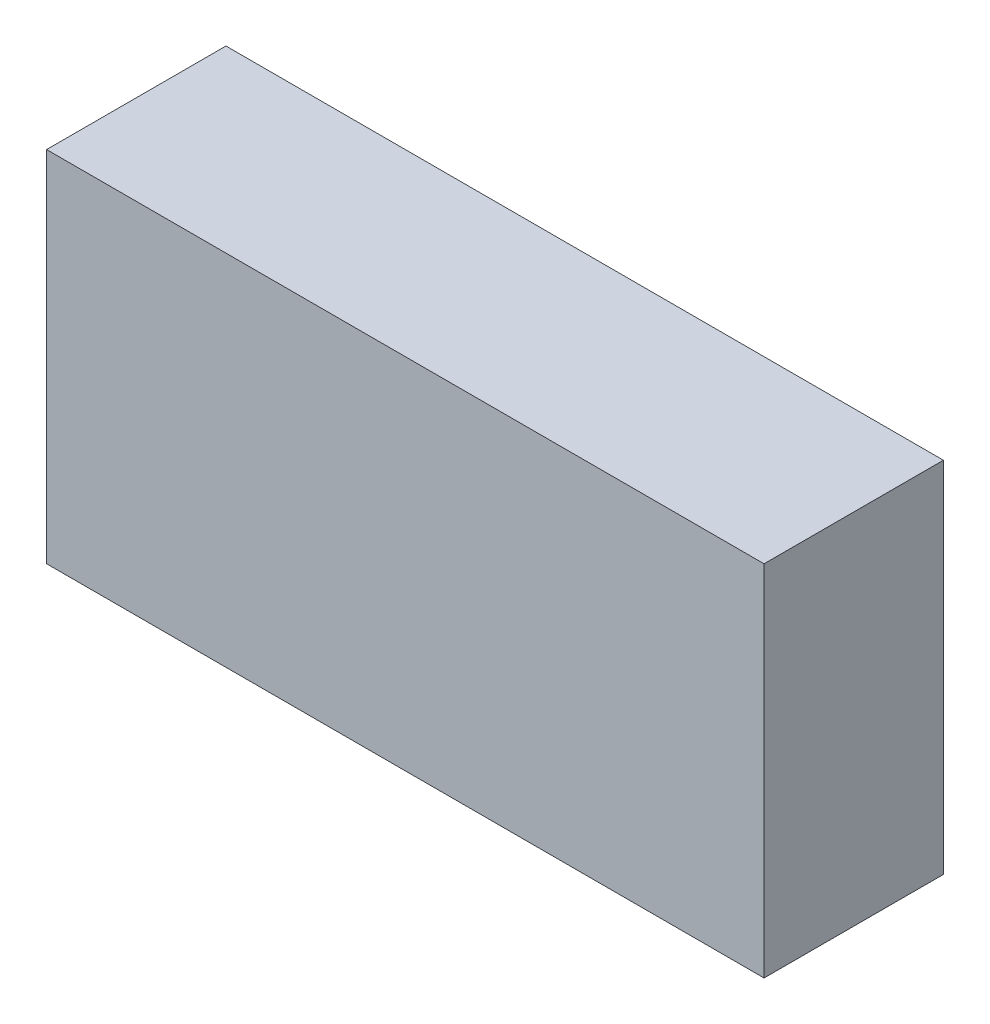
ISO-10303-21;
HEADER;
FILE_DESCRIPTION(('STEP AP214'),'2;1');
FILE_NAME('part.step','',(''),(''),'','','');
FILE_SCHEMA(('AUTOMOTIVE_DESIGN { 1 0 10303 214 1 1 1 1 }'));
ENDSEC;
DATA;
#1=APPLICATION_CONTEXT('core data for automotive mechanical design processes');
#2=APPLICATION_PROTOCOL_DEFINITION('international standard','automotive_design',2000,#1);
#3=PRODUCT_CONTEXT('',#1,'mechanical');
#4=PRODUCT('Part','Part','',(#3));
#5=PRODUCT_RELATED_PRODUCT_CATEGORY('part','',(#4));
#6=PRODUCT_DEFINITION_FORMATION('','',#4);
#7=PRODUCT_DEFINITION_CONTEXT('part definition',#1,'design');
#8=PRODUCT_DEFINITION('design','',#6,#7);
#9=PRODUCT_DEFINITION_SHAPE('','',#8);
#10=(LENGTH_UNIT() NAMED_UNIT(*) SI_UNIT(.MILLI.,.METRE.));
#11=(NAMED_UNIT(*) PLANE_ANGLE_UNIT() SI_UNIT($,.RADIAN.));
#12=(NAMED_UNIT(*) SI_UNIT($,.STERADIAN.) SOLID_ANGLE_UNIT());
#13=UNCERTAINTY_MEASURE_WITH_UNIT(LENGTH_MEASURE(1.E-05),#10,'distance_accuracy_value','');
#14=(GEOMETRIC_REPRESENTATION_CONTEXT(3) GLOBAL_UNCERTAINTY_ASSIGNED_CONTEXT((#13)) GLOBAL_UNIT_ASSIGNED_CONTEXT((#10,
#11,#12)) REPRESENTATION_CONTEXT('',''));
#15=CARTESIAN_POINT('',(0.,0.,0.));
#16=DIRECTION('',(0.,0.,1.));
#17=DIRECTION('',(1.,0.,0.));
#18=AXIS2_PLACEMENT_3D('',#15,#16,#17);
#19=CARTESIAN_POINT('',(-0.775004800000001,-0.3750056,0.3999992));
#20=DIRECTION('',(1.,0.,0.));
#21=DIRECTION('',(0.,1.,0.));
#22=AXIS2_PLACEMENT_3D('',#19,#20,#21);
#23=PLANE('',#22);
#24=DIRECTION('',(0.,-1.,0.));
#25=VECTOR('',#24,1.);
#26=CARTESIAN_POINT('',(-0.775004800000001,-0.3750056,0.));
#27=LINE('',#26,#25);
#28=CARTESIAN_POINT('',(-0.775004800000002,0.424992799999999,0.));
#29=VERTEX_POINT('',#28);
#30=CARTESIAN_POINT('',(-0.775004800000001,-0.3750056,0.));
#31=VERTEX_POINT('',#30);
#32=EDGE_CURVE('E95',#29,#31,#27,.T.);
#33=ORIENTED_EDGE('',*,*,#32,.T.);
#34=DIRECTION('',(0.,0.,-1.));
#35=VECTOR('',#34,1.);
#36=CARTESIAN_POINT('',(-0.775004800000001,-0.3750056,0.3999992));
#37=LINE('',#36,#35);
#38=CARTESIAN_POINT('',(-0.775004800000001,-0.3750056,0.3999992));
#39=VERTEX_POINT('',#38);
#40=EDGE_CURVE('E11',#39,#31,#37,.T.);
#41=ORIENTED_EDGE('',*,*,#40,.F.);
#42=DIRECTION('',(0.,-1.,0.));
#43=VECTOR('',#42,1.);
#44=CARTESIAN_POINT('',(-0.775004800000001,-0.3750056,0.3999992));
#45=LINE('',#44,#43);
#46=CARTESIAN_POINT('',(-0.775004800000002,0.424992799999999,0.3999992));
#47=VERTEX_POINT('',#46);
#48=EDGE_CURVE('E83',#47,#39,#45,.T.);
#49=ORIENTED_EDGE('',*,*,#48,.F.);
#50=DIRECTION('',(0.,0.,-1.));
#51=VECTOR('',#50,1.);
#52=CARTESIAN_POINT('',(-0.775004800000002,0.424992799999999,0.3999992));
#53=LINE('',#52,#51);
#54=EDGE_CURVE('E91',#47,#29,#53,.T.);
#55=ORIENTED_EDGE('',*,*,#54,.T.);
#56=EDGE_LOOP('',(#33,#41,#49,#55));
#57=FACE_BOUND('',#56,.T.);
#58=ADVANCED_FACE('F32',(#57),#23,.F.);
#59=CARTESIAN_POINT('',(0.824992000000001,-0.3750056,0.3999992));
#60=DIRECTION('',(0.,1.,0.));
#61=DIRECTION('',(0.,0.,1.));
#62=AXIS2_PLACEMENT_3D('',#59,#60,#61);
#63=PLANE('',#62);
#64=DIRECTION('',(1.,0.,0.));
#65=VECTOR('',#64,1.);
#66=CARTESIAN_POINT('',(0.824992000000001,-0.3750056,0.));
#67=LINE('',#66,#65);
#68=CARTESIAN_POINT('',(0.824992000000001,-0.3750056,0.));
#69=VERTEX_POINT('',#68);
#70=EDGE_CURVE('E87',#31,#69,#67,.T.);
#71=ORIENTED_EDGE('',*,*,#70,.T.);
#72=DIRECTION('',(0.,0.,-1.));
#73=VECTOR('',#72,1.);
#74=CARTESIAN_POINT('',(0.824992000000001,-0.3750056,0.3999992));
#75=LINE('',#74,#73);
#76=CARTESIAN_POINT('',(0.824992000000001,-0.3750056,0.3999992));
#77=VERTEX_POINT('',#76);
#78=EDGE_CURVE('E40',#77,#69,#75,.T.);
#79=ORIENTED_EDGE('',*,*,#78,.F.);
#80=DIRECTION('',(1.,0.,0.));
#81=VECTOR('',#80,1.);
#82=CARTESIAN_POINT('',(0.824992000000001,-0.3750056,0.3999992));
#83=LINE('',#82,#81);
#84=EDGE_CURVE('E78',#39,#77,#83,.T.);
#85=ORIENTED_EDGE('',*,*,#84,.F.);
#86=ORIENTED_EDGE('',*,*,#40,.T.);
#87=EDGE_LOOP('',(#71,#79,#85,#86));
#88=FACE_BOUND('',#87,.T.);
#89=ADVANCED_FACE('F86',(#88),#63,.F.);
#90=CARTESIAN_POINT('',(0.824992,0.424992799999999,0.3999992));
#91=DIRECTION('',(-1.,0.,0.));
#92=DIRECTION('',(0.,-1.,0.));
#93=AXIS2_PLACEMENT_3D('',#90,#91,#92);
#94=PLANE('',#93);
#95=DIRECTION('',(0.,1.,0.));
#96=VECTOR('',#95,1.);
#97=CARTESIAN_POINT('',(0.824992,0.424992799999999,0.));
#98=LINE('',#97,#96);
#99=CARTESIAN_POINT('',(0.824992,0.424992799999999,0.));
#100=VERTEX_POINT('',#99);
#101=EDGE_CURVE('E65',#69,#100,#98,.T.);
#102=ORIENTED_EDGE('',*,*,#101,.T.);
#103=DIRECTION('',(0.,0.,-1.));
#104=VECTOR('',#103,1.);
#105=CARTESIAN_POINT('',(0.824992,0.424992799999999,0.3999992));
#106=LINE('',#105,#104);
#107=CARTESIAN_POINT('',(0.824992,0.424992799999999,0.3999992));
#108=VERTEX_POINT('',#107);
#109=EDGE_CURVE('E88',#108,#100,#106,.T.);
#110=ORIENTED_EDGE('',*,*,#109,.F.);
#111=DIRECTION('',(0.,1.,0.));
#112=VECTOR('',#111,1.);
#113=CARTESIAN_POINT('',(0.824992,0.424992799999999,0.3999992));
#114=LINE('',#113,#112);
#115=EDGE_CURVE('E81',#77,#108,#114,.T.);
#116=ORIENTED_EDGE('',*,*,#115,.F.);
#117=ORIENTED_EDGE('',*,*,#78,.T.);
#118=EDGE_LOOP('',(#102,#110,#116,#117));
#119=FACE_BOUND('',#118,.T.);
#120=ADVANCED_FACE('F89',(#119),#94,.F.);
#121=CARTESIAN_POINT('',(-0.775004800000002,0.424992799999999,0.3999992));
#122=DIRECTION('',(0.,-1.,0.));
#123=DIRECTION('',(0.,0.,-1.));
#124=AXIS2_PLACEMENT_3D('',#121,#122,#123);
#125=PLANE('',#124);
#126=DIRECTION('',(-1.,0.,0.));
#127=VECTOR('',#126,1.);
#128=CARTESIAN_POINT('',(-0.775004800000002,0.424992799999999,0.));
#129=LINE('',#128,#127);
#130=EDGE_CURVE('E71',#100,#29,#129,.T.);
#131=ORIENTED_EDGE('',*,*,#130,.T.);
#132=ORIENTED_EDGE('',*,*,#54,.F.);
#133=DIRECTION('',(-1.,0.,0.));
#134=VECTOR('',#133,1.);
#135=CARTESIAN_POINT('',(-0.775004800000002,0.424992799999999,0.3999992));
#136=LINE('',#135,#134);
#137=EDGE_CURVE('E48',#108,#47,#136,.T.);
#138=ORIENTED_EDGE('',*,*,#137,.F.);
#139=ORIENTED_EDGE('',*,*,#109,.T.);
#140=EDGE_LOOP('',(#131,#132,#138,#139));
#141=FACE_BOUND('',#140,.T.);
#142=ADVANCED_FACE('F102',(#141),#125,.F.);
#143=CARTESIAN_POINT('',(0.,0.,0.3999992));
#144=DIRECTION('',(0.,0.,-1.));
#145=DIRECTION('',(-1.,0.,0.));
#146=AXIS2_PLACEMENT_3D('',#143,#144,#145);
#147=PLANE('',#146);
#148=ORIENTED_EDGE('',*,*,#48,.T.);
#149=ORIENTED_EDGE('',*,*,#84,.T.);
#150=ORIENTED_EDGE('',*,*,#115,.T.);
#151=ORIENTED_EDGE('',*,*,#137,.T.);
#152=EDGE_LOOP('',(#148,#149,#150,#151));
#153=FACE_BOUND('',#152,.T.);
#154=ADVANCED_FACE('F79',(#153),#147,.F.);
#155=CARTESIAN_POINT('',(0.,0.,0.));
#156=DIRECTION('',(0.,0.,-1.));
#157=DIRECTION('',(-1.,0.,0.));
#158=AXIS2_PLACEMENT_3D('',#155,#156,#157);
#159=PLANE('',#158);
#160=ORIENTED_EDGE('',*,*,#32,.F.);
#161=ORIENTED_EDGE('',*,*,#130,.F.);
#162=ORIENTED_EDGE('',*,*,#101,.F.);
#163=ORIENTED_EDGE('',*,*,#70,.F.);
#164=EDGE_LOOP('',(#160,#161,#162,#163));
#165=FACE_BOUND('',#164,.T.);
#166=ADVANCED_FACE('F105',(#165),#159,.T.);
#167=CLOSED_SHELL('',(#58,#89,#120,#142,#154,#166));
#168=MANIFOLD_SOLID_BREP('B2',#167);
#169=ADVANCED_BREP_SHAPE_REPRESENTATION('',(#18,#168),#14);
#170=SHAPE_DEFINITION_REPRESENTATION(#9,#169);
ENDSEC;
END-ISO-10303-21;
